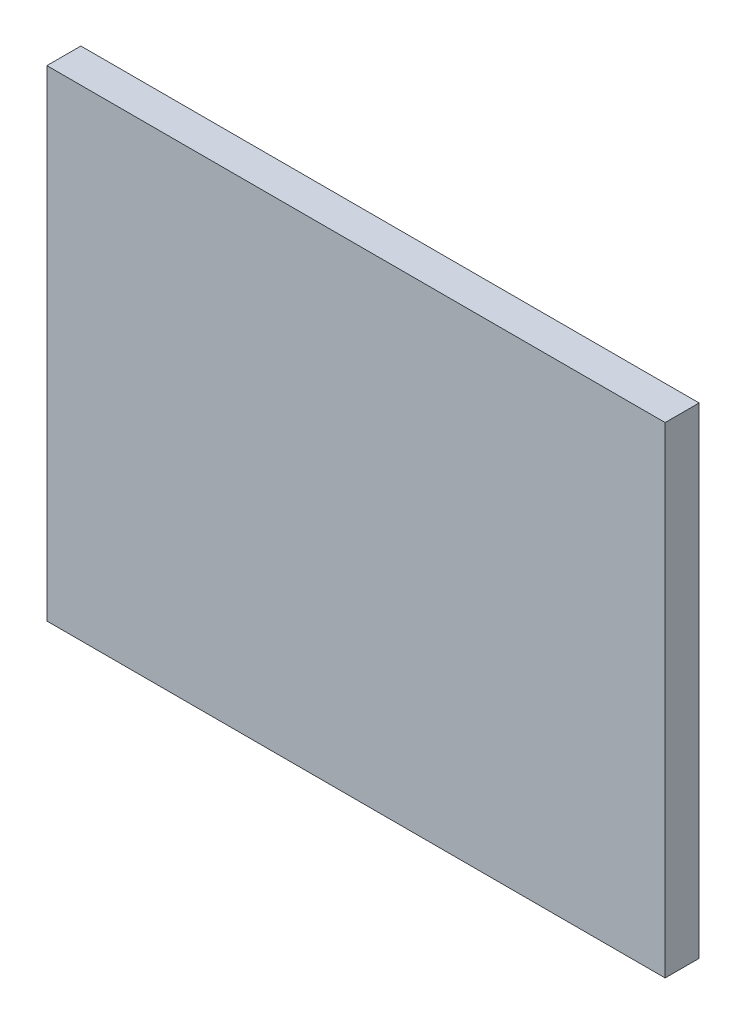
ISO-10303-21;
HEADER;
FILE_DESCRIPTION(('STEP AP214'),'2;1');
FILE_NAME('part.step','',(''),(''),'','','');
FILE_SCHEMA(('AUTOMOTIVE_DESIGN { 1 0 10303 214 1 1 1 1 }'));
ENDSEC;
DATA;
#1=APPLICATION_CONTEXT('core data for automotive mechanical design processes');
#2=APPLICATION_PROTOCOL_DEFINITION('international standard','automotive_design',2000,#1);
#3=PRODUCT_CONTEXT('',#1,'mechanical');
#4=PRODUCT('Part','Part','',(#3));
#5=PRODUCT_RELATED_PRODUCT_CATEGORY('part','',(#4));
#6=PRODUCT_DEFINITION_FORMATION('','',#4);
#7=PRODUCT_DEFINITION_CONTEXT('part definition',#1,'design');
#8=PRODUCT_DEFINITION('design','',#6,#7);
#9=PRODUCT_DEFINITION_SHAPE('','',#8);
#10=(LENGTH_UNIT() NAMED_UNIT(*) SI_UNIT(.MILLI.,.METRE.));
#11=(NAMED_UNIT(*) PLANE_ANGLE_UNIT() SI_UNIT($,.RADIAN.));
#12=(NAMED_UNIT(*) SI_UNIT($,.STERADIAN.) SOLID_ANGLE_UNIT());
#13=UNCERTAINTY_MEASURE_WITH_UNIT(LENGTH_MEASURE(1.E-05),#10,'distance_accuracy_value','');
#14=(GEOMETRIC_REPRESENTATION_CONTEXT(3) GLOBAL_UNCERTAINTY_ASSIGNED_CONTEXT((#13)) GLOBAL_UNIT_ASSIGNED_CONTEXT((#10,
#11,#12)) REPRESENTATION_CONTEXT('',''));
#15=CARTESIAN_POINT('',(0.,0.,0.));
#16=DIRECTION('',(0.,0.,1.));
#17=DIRECTION('',(1.,0.,0.));
#18=AXIS2_PLACEMENT_3D('',#15,#16,#17);
#19=CARTESIAN_POINT('',(21.85,-17.,2.4));
#20=DIRECTION('',(-1.,0.,0.));
#21=DIRECTION('',(0.,0.,1.));
#22=AXIS2_PLACEMENT_3D('',#19,#20,#21);
#23=PLANE('',#22);
#24=DIRECTION('',(0.,1.,0.));
#25=VECTOR('',#24,1.);
#26=CARTESIAN_POINT('',(21.85,-17.,0.));
#27=LINE('',#26,#25);
#28=CARTESIAN_POINT('',(21.85,-17.,0.));
#29=VERTEX_POINT('',#28);
#30=CARTESIAN_POINT('',(21.85,17.,0.));
#31=VERTEX_POINT('',#30);
#32=EDGE_CURVE('E102',#29,#31,#27,.T.);
#33=ORIENTED_EDGE('',*,*,#32,.T.);
#34=DIRECTION('',(0.,0.,-1.));
#35=VECTOR('',#34,1.);
#36=CARTESIAN_POINT('',(21.85,17.,2.4));
#37=LINE('',#36,#35);
#38=CARTESIAN_POINT('',(21.85,17.,2.4));
#39=VERTEX_POINT('',#38);
#40=EDGE_CURVE('E11',#39,#31,#37,.T.);
#41=ORIENTED_EDGE('',*,*,#40,.F.);
#42=DIRECTION('',(0.,1.,0.));
#43=VECTOR('',#42,1.);
#44=CARTESIAN_POINT('',(21.85,-17.,2.4));
#45=LINE('',#44,#43);
#46=CARTESIAN_POINT('',(21.85,-17.,2.4));
#47=VERTEX_POINT('',#46);
#48=EDGE_CURVE('E90',#47,#39,#45,.T.);
#49=ORIENTED_EDGE('',*,*,#48,.F.);
#50=DIRECTION('',(0.,0.,-1.));
#51=VECTOR('',#50,1.);
#52=CARTESIAN_POINT('',(21.85,-17.,2.4));
#53=LINE('',#52,#51);
#54=EDGE_CURVE('E98',#47,#29,#53,.T.);
#55=ORIENTED_EDGE('',*,*,#54,.T.);
#56=EDGE_LOOP('',(#33,#41,#49,#55));
#57=FACE_BOUND('',#56,.T.);
#58=ADVANCED_FACE('F39',(#57),#23,.F.);
#59=CARTESIAN_POINT('',(-21.85,17.,2.4));
#60=DIRECTION('',(0.,-1.,0.));
#61=DIRECTION('',(0.,0.,-1.));
#62=AXIS2_PLACEMENT_3D('',#59,#60,#61);
#63=PLANE('',#62);
#64=DIRECTION('',(-1.,0.,0.));
#65=VECTOR('',#64,1.);
#66=CARTESIAN_POINT('',(-21.85,17.,0.));
#67=LINE('',#66,#65);
#68=CARTESIAN_POINT('',(-21.85,17.,0.));
#69=VERTEX_POINT('',#68);
#70=EDGE_CURVE('E94',#31,#69,#67,.T.);
#71=ORIENTED_EDGE('',*,*,#70,.T.);
#72=DIRECTION('',(0.,0.,-1.));
#73=VECTOR('',#72,1.);
#74=CARTESIAN_POINT('',(-21.85,17.,2.4));
#75=LINE('',#74,#73);
#76=CARTESIAN_POINT('',(-21.85,17.,2.4));
#77=VERTEX_POINT('',#76);
#78=EDGE_CURVE('E47',#77,#69,#75,.T.);
#79=ORIENTED_EDGE('',*,*,#78,.F.);
#80=DIRECTION('',(-1.,0.,0.));
#81=VECTOR('',#80,1.);
#82=CARTESIAN_POINT('',(-21.85,17.,2.4));
#83=LINE('',#82,#81);
#84=EDGE_CURVE('E85',#39,#77,#83,.T.);
#85=ORIENTED_EDGE('',*,*,#84,.F.);
#86=ORIENTED_EDGE('',*,*,#40,.T.);
#87=EDGE_LOOP('',(#71,#79,#85,#86));
#88=FACE_BOUND('',#87,.T.);
#89=ADVANCED_FACE('F93',(#88),#63,.F.);
#90=CARTESIAN_POINT('',(-21.85,-17.,2.4));
#91=DIRECTION('',(1.,0.,0.));
#92=DIRECTION('',(0.,0.,-1.));
#93=AXIS2_PLACEMENT_3D('',#90,#91,#92);
#94=PLANE('',#93);
#95=DIRECTION('',(0.,-1.,0.));
#96=VECTOR('',#95,1.);
#97=CARTESIAN_POINT('',(-21.85,-17.,0.));
#98=LINE('',#97,#96);
#99=CARTESIAN_POINT('',(-21.85,-17.,0.));
#100=VERTEX_POINT('',#99);
#101=EDGE_CURVE('E72',#69,#100,#98,.T.);
#102=ORIENTED_EDGE('',*,*,#101,.T.);
#103=DIRECTION('',(0.,0.,-1.));
#104=VECTOR('',#103,1.);
#105=CARTESIAN_POINT('',(-21.85,-17.,2.4));
#106=LINE('',#105,#104);
#107=CARTESIAN_POINT('',(-21.85,-17.,2.4));
#108=VERTEX_POINT('',#107);
#109=EDGE_CURVE('E95',#108,#100,#106,.T.);
#110=ORIENTED_EDGE('',*,*,#109,.F.);
#111=DIRECTION('',(0.,-1.,0.));
#112=VECTOR('',#111,1.);
#113=CARTESIAN_POINT('',(-21.85,-17.,2.4));
#114=LINE('',#113,#112);
#115=EDGE_CURVE('E88',#77,#108,#114,.T.);
#116=ORIENTED_EDGE('',*,*,#115,.F.);
#117=ORIENTED_EDGE('',*,*,#78,.T.);
#118=EDGE_LOOP('',(#102,#110,#116,#117));
#119=FACE_BOUND('',#118,.T.);
#120=ADVANCED_FACE('F96',(#119),#94,.F.);
#121=CARTESIAN_POINT('',(-21.85,-17.,2.4));
#122=DIRECTION('',(0.,1.,0.));
#123=DIRECTION('',(0.,0.,1.));
#124=AXIS2_PLACEMENT_3D('',#121,#122,#123);
#125=PLANE('',#124);
#126=DIRECTION('',(1.,0.,0.));
#127=VECTOR('',#126,1.);
#128=CARTESIAN_POINT('',(-21.85,-17.,0.));
#129=LINE('',#128,#127);
#130=EDGE_CURVE('E78',#100,#29,#129,.T.);
#131=ORIENTED_EDGE('',*,*,#130,.T.);
#132=ORIENTED_EDGE('',*,*,#54,.F.);
#133=DIRECTION('',(1.,0.,0.));
#134=VECTOR('',#133,1.);
#135=CARTESIAN_POINT('',(-21.85,-17.,2.4));
#136=LINE('',#135,#134);
#137=EDGE_CURVE('E55',#108,#47,#136,.T.);
#138=ORIENTED_EDGE('',*,*,#137,.F.);
#139=ORIENTED_EDGE('',*,*,#109,.T.);
#140=EDGE_LOOP('',(#131,#132,#138,#139));
#141=FACE_BOUND('',#140,.T.);
#142=ADVANCED_FACE('F109',(#141),#125,.F.);
#143=CARTESIAN_POINT('',(0.,0.,2.4));
#144=DIRECTION('',(0.,0.,-1.));
#145=DIRECTION('',(-1.,0.,0.));
#146=AXIS2_PLACEMENT_3D('',#143,#144,#145);
#147=PLANE('',#146);
#148=ORIENTED_EDGE('',*,*,#48,.T.);
#149=ORIENTED_EDGE('',*,*,#84,.T.);
#150=ORIENTED_EDGE('',*,*,#115,.T.);
#151=ORIENTED_EDGE('',*,*,#137,.T.);
#152=EDGE_LOOP('',(#148,#149,#150,#151));
#153=FACE_BOUND('',#152,.T.);
#154=ADVANCED_FACE('F86',(#153),#147,.F.);
#155=CARTESIAN_POINT('',(0.,0.,0.));
#156=DIRECTION('',(0.,0.,-1.));
#157=DIRECTION('',(-1.,0.,0.));
#158=AXIS2_PLACEMENT_3D('',#155,#156,#157);
#159=PLANE('',#158);
#160=ORIENTED_EDGE('',*,*,#32,.F.);
#161=ORIENTED_EDGE('',*,*,#130,.F.);
#162=ORIENTED_EDGE('',*,*,#101,.F.);
#163=ORIENTED_EDGE('',*,*,#70,.F.);
#164=EDGE_LOOP('',(#160,#161,#162,#163));
#165=FACE_BOUND('',#164,.T.);
#166=ADVANCED_FACE('F112',(#165),#159,.T.);
#167=CLOSED_SHELL('',(#58,#89,#120,#142,#154,#166));
#168=MANIFOLD_SOLID_BREP('B2',#167);
#169=ADVANCED_BREP_SHAPE_REPRESENTATION('',(#18,#168),#14);
#170=SHAPE_DEFINITION_REPRESENTATION(#9,#169);
ENDSEC;
END-ISO-10303-21;
